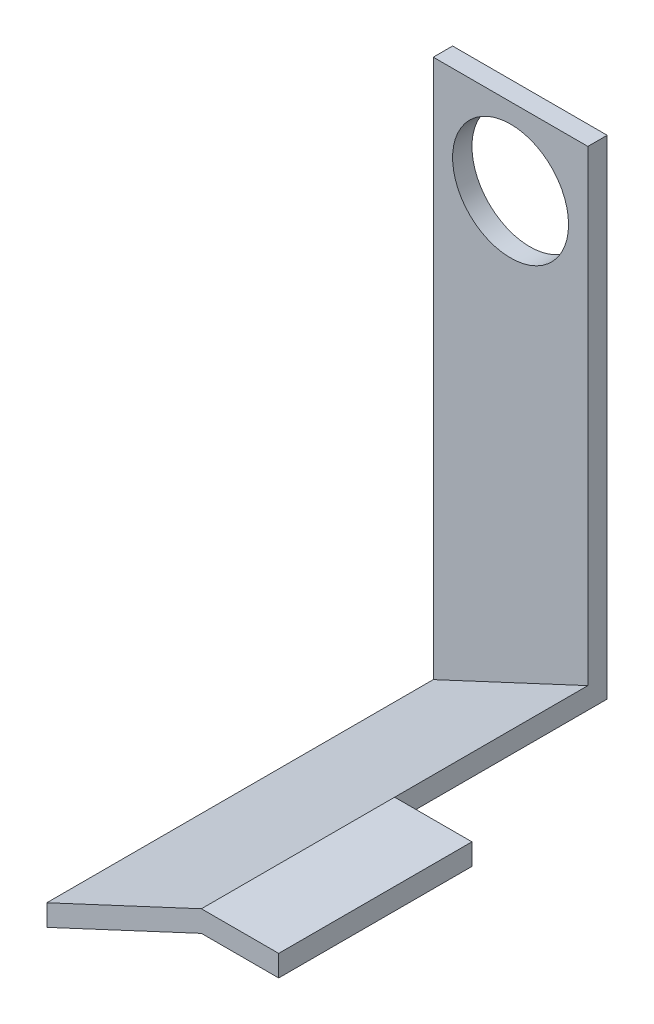
ISO-10303-21;
HEADER;
FILE_DESCRIPTION(('STEP AP214'),'2;1');
FILE_NAME('part.step','',(''),(''),'','','');
FILE_SCHEMA(('AUTOMOTIVE_DESIGN { 1 0 10303 214 1 1 1 1 }'));
ENDSEC;
DATA;
#1=APPLICATION_CONTEXT('core data for automotive mechanical design processes');
#2=APPLICATION_PROTOCOL_DEFINITION('international standard','automotive_design',2000,#1);
#3=PRODUCT_CONTEXT('',#1,'mechanical');
#4=PRODUCT('Part','Part','',(#3));
#5=PRODUCT_RELATED_PRODUCT_CATEGORY('part','',(#4));
#6=PRODUCT_DEFINITION_FORMATION('','',#4);
#7=PRODUCT_DEFINITION_CONTEXT('part definition',#1,'design');
#8=PRODUCT_DEFINITION('design','',#6,#7);
#9=PRODUCT_DEFINITION_SHAPE('','',#8);
#10=(LENGTH_UNIT() NAMED_UNIT(*) SI_UNIT(.MILLI.,.METRE.));
#11=(NAMED_UNIT(*) PLANE_ANGLE_UNIT() SI_UNIT($,.RADIAN.));
#12=(NAMED_UNIT(*) SI_UNIT($,.STERADIAN.) SOLID_ANGLE_UNIT());
#13=UNCERTAINTY_MEASURE_WITH_UNIT(LENGTH_MEASURE(1.E-05),#10,'distance_accuracy_value','');
#14=(GEOMETRIC_REPRESENTATION_CONTEXT(3) GLOBAL_UNCERTAINTY_ASSIGNED_CONTEXT((#13)) GLOBAL_UNIT_ASSIGNED_CONTEXT((#10,
#11,#12)) REPRESENTATION_CONTEXT('',''));
#15=CARTESIAN_POINT('',(0.,0.,0.));
#16=DIRECTION('',(0.,0.,1.));
#17=DIRECTION('',(1.,0.,0.));
#18=AXIS2_PLACEMENT_3D('',#15,#16,#17);
#19=CARTESIAN_POINT('',(2.,-6.63476936738002,0.5));
#20=DIRECTION('',(-1.,0.,0.));
#21=DIRECTION('',(0.,0.,1.));
#22=AXIS2_PLACEMENT_3D('',#19,#20,#21);
#23=PLANE('',#22);
#24=DIRECTION('',(0.,1.,0.));
#25=VECTOR('',#24,1.);
#26=CARTESIAN_POINT('',(2.,-6.08308040789877,5.5));
#27=LINE('',#26,#25);
#28=CARTESIAN_POINT('',(2.,-6.63476936738002,5.5));
#29=VERTEX_POINT('',#28);
#30=CARTESIAN_POINT('',(2.,-6.08308040789877,5.5));
#31=VERTEX_POINT('',#30);
#32=EDGE_CURVE('E47',#29,#31,#27,.T.);
#33=ORIENTED_EDGE('',*,*,#32,.F.);
#34=DIRECTION('',(0.,0.,-1.));
#35=VECTOR('',#34,1.);
#36=CARTESIAN_POINT('',(2.,-6.63476936738002,0.5));
#37=LINE('',#36,#35);
#38=CARTESIAN_POINT('',(2.,-6.63476936738002,0.));
#39=VERTEX_POINT('',#38);
#40=EDGE_CURVE('E161',#29,#39,#37,.T.);
#41=ORIENTED_EDGE('',*,*,#40,.T.);
#42=DIRECTION('',(0.,1.,0.));
#43=VECTOR('',#42,1.);
#44=CARTESIAN_POINT('',(2.,-6.63476936738002,0.));
#45=LINE('',#44,#43);
#46=CARTESIAN_POINT('',(2.,6.,0.));
#47=VERTEX_POINT('',#46);
#48=EDGE_CURVE('E151',#39,#47,#45,.T.);
#49=ORIENTED_EDGE('',*,*,#48,.T.);
#50=DIRECTION('',(0.,0.,-1.));
#51=VECTOR('',#50,1.);
#52=CARTESIAN_POINT('',(2.,6.,0.5));
#53=LINE('',#52,#51);
#54=CARTESIAN_POINT('',(2.,6.,0.5));
#55=VERTEX_POINT('',#54);
#56=EDGE_CURVE('E11',#55,#47,#53,.T.);
#57=ORIENTED_EDGE('',*,*,#56,.F.);
#58=DIRECTION('',(0.,1.,0.));
#59=VECTOR('',#58,1.);
#60=CARTESIAN_POINT('',(2.,-6.63476936738002,0.5));
#61=LINE('',#60,#59);
#62=CARTESIAN_POINT('',(2.,-6.08308040789877,0.5));
#63=VERTEX_POINT('',#62);
#64=EDGE_CURVE('E154',#63,#55,#61,.T.);
#65=ORIENTED_EDGE('',*,*,#64,.F.);
#66=DIRECTION('',(0.,0.,-1.));
#67=VECTOR('',#66,1.);
#68=CARTESIAN_POINT('',(2.,-6.08308040789877,10.5));
#69=LINE('',#68,#67);
#70=EDGE_CURVE('E54',#31,#63,#69,.T.);
#71=ORIENTED_EDGE('',*,*,#70,.F.);
#72=EDGE_LOOP('',(#33,#41,#49,#57,#65,#71));
#73=FACE_BOUND('',#72,.T.);
#74=ADVANCED_FACE('F33',(#73),#23,.F.);
#75=CARTESIAN_POINT('',(0.,0.,0.5));
#76=DIRECTION('',(0.,0.,-1.));
#77=DIRECTION('',(-1.,0.,0.));
#78=AXIS2_PLACEMENT_3D('',#75,#76,#77);
#79=PLANE('',#78);
#80=CARTESIAN_POINT('',(0.,4.,0.5));
#81=DIRECTION('',(0.,0.,1.));
#82=DIRECTION('',(1.,0.,0.));
#83=AXIS2_PLACEMENT_3D('',#80,#81,#82);
#84=CIRCLE('',#83,1.5);
#85=CARTESIAN_POINT('',(1.5,4.,0.5));
#86=VERTEX_POINT('',#85);
#87=EDGE_CURVE('E148',#86,#86,#84,.T.);
#88=ORIENTED_EDGE('',*,*,#87,.F.);
#89=EDGE_LOOP('',(#88));
#90=FACE_BOUND('',#89,.T.);
#91=DIRECTION('',(-0.906307787036651,-0.422618261740697,0.));
#92=VECTOR('',#91,1.);
#93=CARTESIAN_POINT('',(2.,-6.08308040789877,0.5));
#94=LINE('',#93,#92);
#95=CARTESIAN_POINT('',(-2.,-7.94831104051876,0.5));
#96=VERTEX_POINT('',#95);
#97=EDGE_CURVE('E130',#63,#96,#94,.T.);
#98=ORIENTED_EDGE('',*,*,#97,.F.);
#99=ORIENTED_EDGE('',*,*,#64,.T.);
#100=DIRECTION('',(-1.,0.,0.));
#101=VECTOR('',#100,1.);
#102=CARTESIAN_POINT('',(-2.,6.,0.5));
#103=LINE('',#102,#101);
#104=CARTESIAN_POINT('',(-2.,6.,0.5));
#105=VERTEX_POINT('',#104);
#106=EDGE_CURVE('E156',#55,#105,#103,.T.);
#107=ORIENTED_EDGE('',*,*,#106,.T.);
#108=DIRECTION('',(0.,-1.,0.));
#109=VECTOR('',#108,1.);
#110=CARTESIAN_POINT('',(-2.,-8.5,0.5));
#111=LINE('',#110,#109);
#112=EDGE_CURVE('E159',#105,#96,#111,.T.);
#113=ORIENTED_EDGE('',*,*,#112,.T.);
#114=EDGE_LOOP('',(#98,#99,#107,#113));
#115=FACE_BOUND('',#114,.T.);
#116=ADVANCED_FACE('F196',(#90,#115),#79,.F.);
#117=CARTESIAN_POINT('',(0.,0.,0.));
#118=DIRECTION('',(0.,0.,-1.));
#119=DIRECTION('',(-1.,0.,0.));
#120=AXIS2_PLACEMENT_3D('',#117,#118,#119);
#121=PLANE('',#120);
#122=ORIENTED_EDGE('',*,*,#48,.F.);
#123=DIRECTION('',(0.906307787036651,0.422618261740697,0.));
#124=VECTOR('',#123,1.);
#125=CARTESIAN_POINT('',(-2.,-8.5,0.));
#126=LINE('',#125,#124);
#127=CARTESIAN_POINT('',(-2.,-8.5,0.));
#128=VERTEX_POINT('',#127);
#129=EDGE_CURVE('E157',#128,#39,#126,.T.);
#130=ORIENTED_EDGE('',*,*,#129,.F.);
#131=DIRECTION('',(0.,-1.,0.));
#132=VECTOR('',#131,1.);
#133=CARTESIAN_POINT('',(-2.,-8.5,0.));
#134=LINE('',#133,#132);
#135=CARTESIAN_POINT('',(-2.,6.,0.));
#136=VERTEX_POINT('',#135);
#137=EDGE_CURVE('E166',#136,#128,#134,.T.);
#138=ORIENTED_EDGE('',*,*,#137,.F.);
#139=DIRECTION('',(-1.,0.,0.));
#140=VECTOR('',#139,1.);
#141=CARTESIAN_POINT('',(-2.,6.,0.));
#142=LINE('',#141,#140);
#143=EDGE_CURVE('E164',#47,#136,#142,.T.);
#144=ORIENTED_EDGE('',*,*,#143,.F.);
#145=EDGE_LOOP('',(#122,#130,#138,#144));
#146=FACE_BOUND('',#145,.T.);
#147=CARTESIAN_POINT('',(0.,4.,0.));
#148=DIRECTION('',(0.,0.,1.));
#149=DIRECTION('',(1.,0.,0.));
#150=AXIS2_PLACEMENT_3D('',#147,#148,#149);
#151=CIRCLE('',#150,1.5);
#152=CARTESIAN_POINT('',(1.5,4.,0.));
#153=VERTEX_POINT('',#152);
#154=EDGE_CURVE('E147',#153,#153,#151,.T.);
#155=ORIENTED_EDGE('',*,*,#154,.T.);
#156=EDGE_LOOP('',(#155));
#157=FACE_BOUND('',#156,.T.);
#158=ADVANCED_FACE('F185',(#146,#157),#121,.T.);
#159=CARTESIAN_POINT('',(-2.,6.,0.5));
#160=DIRECTION('',(0.,-1.,0.));
#161=DIRECTION('',(0.,0.,-1.));
#162=AXIS2_PLACEMENT_3D('',#159,#160,#161);
#163=PLANE('',#162);
#164=ORIENTED_EDGE('',*,*,#143,.T.);
#165=DIRECTION('',(0.,0.,-1.));
#166=VECTOR('',#165,1.);
#167=CARTESIAN_POINT('',(-2.,6.,0.5));
#168=LINE('',#167,#166);
#169=EDGE_CURVE('E40',#105,#136,#168,.T.);
#170=ORIENTED_EDGE('',*,*,#169,.F.);
#171=ORIENTED_EDGE('',*,*,#106,.F.);
#172=ORIENTED_EDGE('',*,*,#56,.T.);
#173=EDGE_LOOP('',(#164,#170,#171,#172));
#174=FACE_BOUND('',#173,.T.);
#175=ADVANCED_FACE('F198',(#174),#163,.F.);
#176=CARTESIAN_POINT('',(-2.,-8.5,0.5));
#177=DIRECTION('',(1.,0.,0.));
#178=DIRECTION('',(0.,0.,-1.));
#179=AXIS2_PLACEMENT_3D('',#176,#177,#178);
#180=PLANE('',#179);
#181=ORIENTED_EDGE('',*,*,#137,.T.);
#182=DIRECTION('',(0.,0.,-1.));
#183=VECTOR('',#182,1.);
#184=CARTESIAN_POINT('',(-2.,-8.5,0.5));
#185=LINE('',#184,#183);
#186=CARTESIAN_POINT('',(-2.,-8.5,10.5));
#187=VERTEX_POINT('',#186);
#188=EDGE_CURVE('E172',#187,#128,#185,.T.);
#189=ORIENTED_EDGE('',*,*,#188,.F.);
#190=DIRECTION('',(0.,-1.,0.));
#191=VECTOR('',#190,1.);
#192=CARTESIAN_POINT('',(-2.,-7.94831104051876,10.5));
#193=LINE('',#192,#191);
#194=CARTESIAN_POINT('',(-2.,-7.94831104051876,10.5));
#195=VERTEX_POINT('',#194);
#196=EDGE_CURVE('E132',#195,#187,#193,.T.);
#197=ORIENTED_EDGE('',*,*,#196,.F.);
#198=DIRECTION('',(0.,0.,-1.));
#199=VECTOR('',#198,1.);
#200=CARTESIAN_POINT('',(-2.,-7.94831104051876,10.5));
#201=LINE('',#200,#199);
#202=EDGE_CURVE('E141',#195,#96,#201,.T.);
#203=ORIENTED_EDGE('',*,*,#202,.T.);
#204=ORIENTED_EDGE('',*,*,#112,.F.);
#205=ORIENTED_EDGE('',*,*,#169,.T.);
#206=EDGE_LOOP('',(#181,#189,#197,#203,#204,#205));
#207=FACE_BOUND('',#206,.T.);
#208=ADVANCED_FACE('F179',(#207),#180,.F.);
#209=CARTESIAN_POINT('',(-2.,-8.5,0.5));
#210=DIRECTION('',(-0.422618261740697,0.906307787036651,0.));
#211=DIRECTION('',(-0.906307787036651,-0.422618261740697,0.));
#212=AXIS2_PLACEMENT_3D('',#209,#210,#211);
#213=PLANE('',#212);
#214=ORIENTED_EDGE('',*,*,#129,.T.);
#215=ORIENTED_EDGE('',*,*,#40,.F.);
#216=CARTESIAN_POINT('',(2.,-6.63476936738002,10.5));
#217=VERTEX_POINT('',#216);
#218=EDGE_CURVE('E170',#217,#29,#37,.T.);
#219=ORIENTED_EDGE('',*,*,#218,.F.);
#220=DIRECTION('',(0.906307787036651,0.422618261740697,0.));
#221=VECTOR('',#220,1.);
#222=CARTESIAN_POINT('',(-2.,-8.5,10.5));
#223=LINE('',#222,#221);
#224=EDGE_CURVE('E129',#187,#217,#223,.T.);
#225=ORIENTED_EDGE('',*,*,#224,.F.);
#226=ORIENTED_EDGE('',*,*,#188,.T.);
#227=EDGE_LOOP('',(#214,#215,#219,#225,#226));
#228=FACE_BOUND('',#227,.T.);
#229=ADVANCED_FACE('F188',(#228),#213,.F.);
#230=CARTESIAN_POINT('',(0.,4.,0.5));
#231=DIRECTION('',(0.,0.,-1.));
#232=DIRECTION('',(-1.,0.,0.));
#233=AXIS2_PLACEMENT_3D('',#230,#231,#232);
#234=CYLINDRICAL_SURFACE('',#233,1.5);
#235=ORIENTED_EDGE('',*,*,#87,.T.);
#236=EDGE_LOOP('',(#235));
#237=FACE_BOUND('',#236,.T.);
#238=ORIENTED_EDGE('',*,*,#154,.F.);
#239=EDGE_LOOP('',(#238));
#240=FACE_BOUND('',#239,.T.);
#241=ADVANCED_FACE('F216',(#237,#240),#234,.F.);
#242=CARTESIAN_POINT('',(2.,-6.08308040789877,10.5));
#243=DIRECTION('',(0.422618261740697,-0.906307787036651,0.));
#244=DIRECTION('',(0.906307787036651,0.422618261740697,0.));
#245=AXIS2_PLACEMENT_3D('',#242,#243,#244);
#246=PLANE('',#245);
#247=ORIENTED_EDGE('',*,*,#97,.T.);
#248=ORIENTED_EDGE('',*,*,#202,.F.);
#249=DIRECTION('',(-0.906307787036651,-0.422618261740697,0.));
#250=VECTOR('',#249,1.);
#251=CARTESIAN_POINT('',(2.,-6.08308040789877,10.5));
#252=LINE('',#251,#250);
#253=CARTESIAN_POINT('',(2.,-6.08308040789877,10.5));
#254=VERTEX_POINT('',#253);
#255=EDGE_CURVE('E140',#254,#195,#252,.T.);
#256=ORIENTED_EDGE('',*,*,#255,.F.);
#257=EDGE_CURVE('E145',#254,#31,#69,.T.);
#258=ORIENTED_EDGE('',*,*,#257,.T.);
#259=ORIENTED_EDGE('',*,*,#70,.T.);
#260=EDGE_LOOP('',(#247,#248,#256,#258,#259));
#261=FACE_BOUND('',#260,.T.);
#262=ADVANCED_FACE('F193',(#261),#246,.F.);
#263=CARTESIAN_POINT('',(0.,0.,10.5));
#264=DIRECTION('',(0.,0.,1.));
#265=DIRECTION('',(1.,0.,0.));
#266=AXIS2_PLACEMENT_3D('',#263,#264,#265);
#267=PLANE('',#266);
#268=ORIENTED_EDGE('',*,*,#196,.T.);
#269=ORIENTED_EDGE('',*,*,#224,.T.);
#270=DIRECTION('',(-1.,0.,0.));
#271=VECTOR('',#270,1.);
#272=CARTESIAN_POINT('',(4.,-6.63476936738002,10.5));
#273=LINE('',#272,#271);
#274=CARTESIAN_POINT('',(4.,-6.63476936738002,10.5));
#275=VERTEX_POINT('',#274);
#276=EDGE_CURVE('E109',#275,#217,#273,.T.);
#277=ORIENTED_EDGE('',*,*,#276,.F.);
#278=DIRECTION('',(0.,-1.,0.));
#279=VECTOR('',#278,1.);
#280=CARTESIAN_POINT('',(4.,-6.08308040789877,10.5));
#281=LINE('',#280,#279);
#282=CARTESIAN_POINT('',(4.,-6.08308040789877,10.5));
#283=VERTEX_POINT('',#282);
#284=EDGE_CURVE('E115',#283,#275,#281,.T.);
#285=ORIENTED_EDGE('',*,*,#284,.F.);
#286=DIRECTION('',(-1.,0.,0.));
#287=VECTOR('',#286,1.);
#288=CARTESIAN_POINT('',(4.,-6.08308040789877,10.5));
#289=LINE('',#288,#287);
#290=EDGE_CURVE('E191',#283,#254,#289,.T.);
#291=ORIENTED_EDGE('',*,*,#290,.T.);
#292=ORIENTED_EDGE('',*,*,#255,.T.);
#293=EDGE_LOOP('',(#268,#269,#277,#285,#291,#292));
#294=FACE_BOUND('',#293,.T.);
#295=ADVANCED_FACE('F127',(#294),#267,.T.);
#296=CARTESIAN_POINT('',(4.,-6.63476936738002,10.5));
#297=DIRECTION('',(0.,1.,0.));
#298=DIRECTION('',(0.,0.,1.));
#299=AXIS2_PLACEMENT_3D('',#296,#297,#298);
#300=PLANE('',#299);
#301=ORIENTED_EDGE('',*,*,#218,.T.);
#302=DIRECTION('',(-1.,0.,0.));
#303=VECTOR('',#302,1.);
#304=CARTESIAN_POINT('',(4.,-6.63476936738002,5.5));
#305=LINE('',#304,#303);
#306=CARTESIAN_POINT('',(4.,-6.63476936738002,5.5));
#307=VERTEX_POINT('',#306);
#308=EDGE_CURVE('E111',#307,#29,#305,.T.);
#309=ORIENTED_EDGE('',*,*,#308,.F.);
#310=DIRECTION('',(0.,0.,-1.));
#311=VECTOR('',#310,1.);
#312=CARTESIAN_POINT('',(4.,-6.63476936738002,10.5));
#313=LINE('',#312,#311);
#314=EDGE_CURVE('E104',#275,#307,#313,.T.);
#315=ORIENTED_EDGE('',*,*,#314,.F.);
#316=ORIENTED_EDGE('',*,*,#276,.T.);
#317=EDGE_LOOP('',(#301,#309,#315,#316));
#318=FACE_BOUND('',#317,.T.);
#319=ADVANCED_FACE('F107',(#318),#300,.F.);
#320=CARTESIAN_POINT('',(4.,-6.08308040789877,5.5));
#321=DIRECTION('',(0.,0.,1.));
#322=DIRECTION('',(1.,0.,0.));
#323=AXIS2_PLACEMENT_3D('',#320,#321,#322);
#324=PLANE('',#323);
#325=ORIENTED_EDGE('',*,*,#32,.T.);
#326=DIRECTION('',(-1.,0.,0.));
#327=VECTOR('',#326,1.);
#328=CARTESIAN_POINT('',(4.,-6.08308040789877,5.5));
#329=LINE('',#328,#327);
#330=CARTESIAN_POINT('',(4.,-6.08308040789877,5.5));
#331=VERTEX_POINT('',#330);
#332=EDGE_CURVE('E134',#331,#31,#329,.T.);
#333=ORIENTED_EDGE('',*,*,#332,.F.);
#334=DIRECTION('',(0.,1.,0.));
#335=VECTOR('',#334,1.);
#336=CARTESIAN_POINT('',(4.,-6.08308040789877,5.5));
#337=LINE('',#336,#335);
#338=EDGE_CURVE('E114',#307,#331,#337,.T.);
#339=ORIENTED_EDGE('',*,*,#338,.F.);
#340=ORIENTED_EDGE('',*,*,#308,.T.);
#341=EDGE_LOOP('',(#325,#333,#339,#340));
#342=FACE_BOUND('',#341,.T.);
#343=ADVANCED_FACE('F236',(#342),#324,.F.);
#344=CARTESIAN_POINT('',(4.,-6.08308040789877,10.5));
#345=DIRECTION('',(0.,-1.,0.));
#346=DIRECTION('',(0.,0.,-1.));
#347=AXIS2_PLACEMENT_3D('',#344,#345,#346);
#348=PLANE('',#347);
#349=ORIENTED_EDGE('',*,*,#257,.F.);
#350=ORIENTED_EDGE('',*,*,#290,.F.);
#351=DIRECTION('',(0.,0.,1.));
#352=VECTOR('',#351,1.);
#353=CARTESIAN_POINT('',(4.,-6.08308040789877,10.5));
#354=LINE('',#353,#352);
#355=EDGE_CURVE('E120',#331,#283,#354,.T.);
#356=ORIENTED_EDGE('',*,*,#355,.F.);
#357=ORIENTED_EDGE('',*,*,#332,.T.);
#358=EDGE_LOOP('',(#349,#350,#356,#357));
#359=FACE_BOUND('',#358,.T.);
#360=ADVANCED_FACE('F239',(#359),#348,.F.);
#361=CARTESIAN_POINT('',(4.,0.,0.));
#362=DIRECTION('',(1.,0.,0.));
#363=DIRECTION('',(0.,0.,-1.));
#364=AXIS2_PLACEMENT_3D('',#361,#362,#363);
#365=PLANE('',#364);
#366=ORIENTED_EDGE('',*,*,#284,.T.);
#367=ORIENTED_EDGE('',*,*,#314,.T.);
#368=ORIENTED_EDGE('',*,*,#338,.T.);
#369=ORIENTED_EDGE('',*,*,#355,.T.);
#370=EDGE_LOOP('',(#366,#367,#368,#369));
#371=FACE_BOUND('',#370,.T.);
#372=ADVANCED_FACE('F118',(#371),#365,.T.);
#373=CLOSED_SHELL('',(#74,#116,#158,#175,#208,#229,#241,#262,#295,#319,#343,#360,#372));
#374=MANIFOLD_SOLID_BREP('B2',#373);
#375=ADVANCED_BREP_SHAPE_REPRESENTATION('',(#18,#374),#14);
#376=SHAPE_DEFINITION_REPRESENTATION(#9,#375);
ENDSEC;
END-ISO-10303-21;
